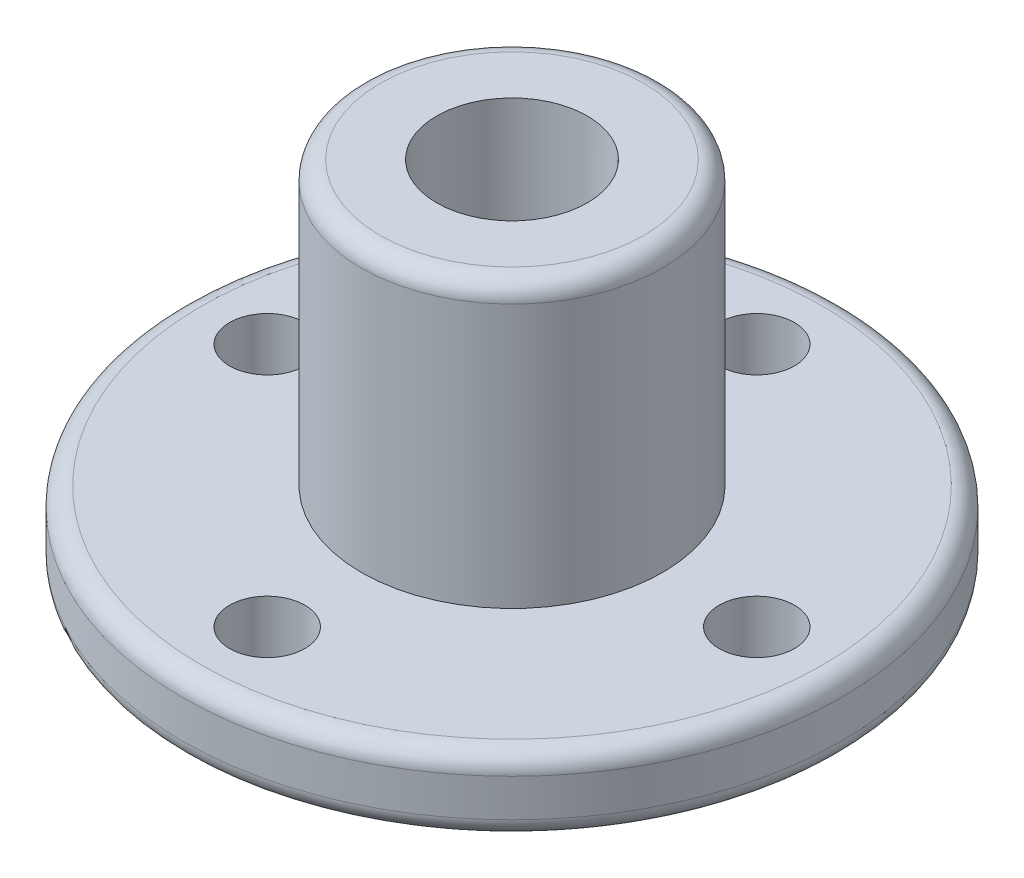
ISO-10303-21;
HEADER;
FILE_DESCRIPTION(('STEP AP214'),'2;1');
FILE_NAME('part.step','',(''),(''),'','','');
FILE_SCHEMA(('AUTOMOTIVE_DESIGN { 1 0 10303 214 1 1 1 1 }'));
ENDSEC;
DATA;
#1=APPLICATION_CONTEXT('core data for automotive mechanical design processes');
#2=APPLICATION_PROTOCOL_DEFINITION('international standard','automotive_design',2000,#1);
#3=PRODUCT_CONTEXT('',#1,'mechanical');
#4=PRODUCT('Part','Part','',(#3));
#5=PRODUCT_RELATED_PRODUCT_CATEGORY('part','',(#4));
#6=PRODUCT_DEFINITION_FORMATION('','',#4);
#7=PRODUCT_DEFINITION_CONTEXT('part definition',#1,'design');
#8=PRODUCT_DEFINITION('design','',#6,#7);
#9=PRODUCT_DEFINITION_SHAPE('','',#8);
#10=(LENGTH_UNIT() NAMED_UNIT(*) SI_UNIT(.MILLI.,.METRE.));
#11=(NAMED_UNIT(*) PLANE_ANGLE_UNIT() SI_UNIT($,.RADIAN.));
#12=(NAMED_UNIT(*) SI_UNIT($,.STERADIAN.) SOLID_ANGLE_UNIT());
#13=UNCERTAINTY_MEASURE_WITH_UNIT(LENGTH_MEASURE(1.E-05),#10,'distance_accuracy_value','');
#14=(GEOMETRIC_REPRESENTATION_CONTEXT(3) GLOBAL_UNCERTAINTY_ASSIGNED_CONTEXT((#13)) GLOBAL_UNIT_ASSIGNED_CONTEXT((#10,
#11,#12)) REPRESENTATION_CONTEXT('',''));
#15=CARTESIAN_POINT('',(0.,0.,0.));
#16=DIRECTION('',(0.,0.,1.));
#17=DIRECTION('',(1.,0.,0.));
#18=AXIS2_PLACEMENT_3D('',#15,#16,#17);
#19=CARTESIAN_POINT('',(0.,4.,0.));
#20=DIRECTION('',(0.,1.,0.));
#21=DIRECTION('',(0.,0.,1.));
#22=AXIS2_PLACEMENT_3D('',#19,#20,#21);
#23=PLANE('',#22);
#24=CARTESIAN_POINT('',(13.,4.,0.));
#25=DIRECTION('',(0.,1.,0.));
#26=DIRECTION('',(0.,0.,1.));
#27=AXIS2_PLACEMENT_3D('',#24,#25,#26);
#28=CIRCLE('',#27,2.);
#29=CARTESIAN_POINT('',(13.,4.,2.));
#30=VERTEX_POINT('',#29);
#31=EDGE_CURVE('E70',#30,#30,#28,.T.);
#32=ORIENTED_EDGE('',*,*,#31,.F.);
#33=EDGE_LOOP('',(#32));
#34=FACE_BOUND('',#33,.T.);
#35=CARTESIAN_POINT('',(0.,4.,-13.));
#36=DIRECTION('',(0.,1.,0.));
#37=DIRECTION('',(0.,0.,1.));
#38=AXIS2_PLACEMENT_3D('',#35,#36,#37);
#39=CIRCLE('',#38,2.);
#40=CARTESIAN_POINT('',(0.,4.,-11.));
#41=VERTEX_POINT('',#40);
#42=EDGE_CURVE('E60',#41,#41,#39,.T.);
#43=ORIENTED_EDGE('',*,*,#42,.F.);
#44=EDGE_LOOP('',(#43));
#45=FACE_BOUND('',#44,.T.);
#46=CARTESIAN_POINT('',(-13.,4.,0.));
#47=DIRECTION('',(0.,1.,0.));
#48=DIRECTION('',(0.,0.,1.));
#49=AXIS2_PLACEMENT_3D('',#46,#47,#48);
#50=CIRCLE('',#49,2.);
#51=CARTESIAN_POINT('',(-13.,4.,2.));
#52=VERTEX_POINT('',#51);
#53=EDGE_CURVE('E57',#52,#52,#50,.T.);
#54=ORIENTED_EDGE('',*,*,#53,.F.);
#55=EDGE_LOOP('',(#54));
#56=FACE_BOUND('',#55,.T.);
#57=CARTESIAN_POINT('',(0.,4.,13.));
#58=DIRECTION('',(0.,1.,0.));
#59=DIRECTION('',(0.,0.,1.));
#60=AXIS2_PLACEMENT_3D('',#57,#58,#59);
#61=CIRCLE('',#60,2.);
#62=CARTESIAN_POINT('',(0.,4.,15.));
#63=VERTEX_POINT('',#62);
#64=EDGE_CURVE('E54',#63,#63,#61,.T.);
#65=ORIENTED_EDGE('',*,*,#64,.F.);
#66=EDGE_LOOP('',(#65));
#67=FACE_BOUND('',#66,.T.);
#68=CARTESIAN_POINT('',(0.,4.,0.));
#69=DIRECTION('',(0.,1.,0.));
#70=DIRECTION('',(0.,0.,1.));
#71=AXIS2_PLACEMENT_3D('',#68,#69,#70);
#72=CIRCLE('',#71,16.5);
#73=CARTESIAN_POINT('',(0.,4.,16.5));
#74=VERTEX_POINT('',#73);
#75=EDGE_CURVE('E152',#74,#74,#72,.T.);
#76=ORIENTED_EDGE('',*,*,#75,.T.);
#77=EDGE_LOOP('',(#76));
#78=FACE_BOUND('',#77,.T.);
#79=CARTESIAN_POINT('',(0.,4.,0.));
#80=DIRECTION('',(0.,1.,0.));
#81=DIRECTION('',(0.,0.,1.));
#82=AXIS2_PLACEMENT_3D('',#79,#80,#81);
#83=CIRCLE('',#82,8.);
#84=CARTESIAN_POINT('',(0.,4.,8.));
#85=VERTEX_POINT('',#84);
#86=EDGE_CURVE('E141',#85,#85,#83,.T.);
#87=ORIENTED_EDGE('',*,*,#86,.F.);
#88=EDGE_LOOP('',(#87));
#89=FACE_BOUND('',#88,.T.);
#90=ADVANCED_FACE('F33',(#34,#45,#56,#67,#78,#89),#23,.T.);
#91=CARTESIAN_POINT('',(0.,4.,0.));
#92=DIRECTION('',(0.,-1.,0.));
#93=DIRECTION('',(0.,0.,-1.));
#94=AXIS2_PLACEMENT_3D('',#91,#92,#93);
#95=CYLINDRICAL_SURFACE('',#94,17.5);
#96=CARTESIAN_POINT('',(0.,3.,0.));
#97=DIRECTION('',(0.,1.,0.));
#98=DIRECTION('',(0.,0.,1.));
#99=AXIS2_PLACEMENT_3D('',#96,#97,#98);
#100=CIRCLE('',#99,17.5);
#101=CARTESIAN_POINT('',(0.,3.,17.5));
#102=VERTEX_POINT('',#101);
#103=EDGE_CURVE('E41',#102,#102,#100,.F.);
#104=ORIENTED_EDGE('',*,*,#103,.T.);
#105=EDGE_LOOP('',(#104));
#106=FACE_BOUND('',#105,.T.);
#107=CARTESIAN_POINT('',(0.,1.,0.));
#108=DIRECTION('',(0.,1.,0.));
#109=DIRECTION('',(0.,0.,1.));
#110=AXIS2_PLACEMENT_3D('',#107,#108,#109);
#111=CIRCLE('',#110,17.5);
#112=CARTESIAN_POINT('',(0.,1.,17.5));
#113=VERTEX_POINT('',#112);
#114=EDGE_CURVE('E46',#113,#113,#111,.T.);
#115=ORIENTED_EDGE('',*,*,#114,.T.);
#116=EDGE_LOOP('',(#115));
#117=FACE_BOUND('',#116,.T.);
#118=ADVANCED_FACE('F111',(#106,#117),#95,.T.);
#119=CARTESIAN_POINT('',(0.,0.,0.));
#120=DIRECTION('',(0.,1.,0.));
#121=DIRECTION('',(0.,0.,1.));
#122=AXIS2_PLACEMENT_3D('',#119,#120,#121);
#123=PLANE('',#122);
#124=CARTESIAN_POINT('',(13.,0.,0.));
#125=DIRECTION('',(0.,1.,0.));
#126=DIRECTION('',(0.,0.,1.));
#127=AXIS2_PLACEMENT_3D('',#124,#125,#126);
#128=CIRCLE('',#127,2.);
#129=CARTESIAN_POINT('',(13.,0.,2.));
#130=VERTEX_POINT('',#129);
#131=EDGE_CURVE('E37',#130,#130,#128,.T.);
#132=ORIENTED_EDGE('',*,*,#131,.T.);
#133=EDGE_LOOP('',(#132));
#134=FACE_BOUND('',#133,.T.);
#135=CARTESIAN_POINT('',(0.,0.,-13.));
#136=DIRECTION('',(0.,1.,0.));
#137=DIRECTION('',(0.,0.,1.));
#138=AXIS2_PLACEMENT_3D('',#135,#136,#137);
#139=CIRCLE('',#138,2.);
#140=CARTESIAN_POINT('',(0.,0.,-11.));
#141=VERTEX_POINT('',#140);
#142=EDGE_CURVE('E58',#141,#141,#139,.T.);
#143=ORIENTED_EDGE('',*,*,#142,.T.);
#144=EDGE_LOOP('',(#143));
#145=FACE_BOUND('',#144,.T.);
#146=CARTESIAN_POINT('',(-13.,0.,0.));
#147=DIRECTION('',(0.,1.,0.));
#148=DIRECTION('',(0.,0.,1.));
#149=AXIS2_PLACEMENT_3D('',#146,#147,#148);
#150=CIRCLE('',#149,2.);
#151=CARTESIAN_POINT('',(-13.,0.,2.));
#152=VERTEX_POINT('',#151);
#153=EDGE_CURVE('E55',#152,#152,#150,.T.);
#154=ORIENTED_EDGE('',*,*,#153,.T.);
#155=EDGE_LOOP('',(#154));
#156=FACE_BOUND('',#155,.T.);
#157=CARTESIAN_POINT('',(0.,0.,13.));
#158=DIRECTION('',(0.,1.,0.));
#159=DIRECTION('',(0.,0.,1.));
#160=AXIS2_PLACEMENT_3D('',#157,#158,#159);
#161=CIRCLE('',#160,2.);
#162=CARTESIAN_POINT('',(0.,0.,15.));
#163=VERTEX_POINT('',#162);
#164=EDGE_CURVE('E50',#163,#163,#161,.T.);
#165=ORIENTED_EDGE('',*,*,#164,.T.);
#166=EDGE_LOOP('',(#165));
#167=FACE_BOUND('',#166,.T.);
#168=CARTESIAN_POINT('',(0.,0.,0.));
#169=DIRECTION('',(0.,1.,0.));
#170=DIRECTION('',(0.,0.,1.));
#171=AXIS2_PLACEMENT_3D('',#168,#169,#170);
#172=CIRCLE('',#171,16.5);
#173=CARTESIAN_POINT('',(0.,0.,16.5));
#174=VERTEX_POINT('',#173);
#175=EDGE_CURVE('E10',#174,#174,#172,.F.);
#176=ORIENTED_EDGE('',*,*,#175,.T.);
#177=EDGE_LOOP('',(#176));
#178=FACE_BOUND('',#177,.T.);
#179=ADVANCED_FACE('F118',(#134,#145,#156,#167,#178),#123,.F.);
#180=CARTESIAN_POINT('',(0.,19.,0.));
#181=DIRECTION('',(0.,1.,0.));
#182=DIRECTION('',(0.,0.,1.));
#183=AXIS2_PLACEMENT_3D('',#180,#181,#182);
#184=PLANE('',#183);
#185=CARTESIAN_POINT('',(0.,19.,0.));
#186=DIRECTION('',(0.,1.,0.));
#187=DIRECTION('',(0.,0.,1.));
#188=AXIS2_PLACEMENT_3D('',#185,#186,#187);
#189=CIRCLE('',#188,7.);
#190=CARTESIAN_POINT('',(0.,19.,7.));
#191=VERTEX_POINT('',#190);
#192=EDGE_CURVE('E140',#191,#191,#189,.T.);
#193=ORIENTED_EDGE('',*,*,#192,.T.);
#194=EDGE_LOOP('',(#193));
#195=FACE_BOUND('',#194,.T.);
#196=CARTESIAN_POINT('',(0.,19.,0.));
#197=DIRECTION('',(0.,1.,0.));
#198=DIRECTION('',(0.,0.,1.));
#199=AXIS2_PLACEMENT_3D('',#196,#197,#198);
#200=CIRCLE('',#199,4.);
#201=CARTESIAN_POINT('',(0.,19.,4.));
#202=VERTEX_POINT('',#201);
#203=EDGE_CURVE('E147',#202,#202,#200,.T.);
#204=ORIENTED_EDGE('',*,*,#203,.F.);
#205=EDGE_LOOP('',(#204));
#206=FACE_BOUND('',#205,.T.);
#207=ADVANCED_FACE('F173',(#195,#206),#184,.T.);
#208=CARTESIAN_POINT('',(0.,19.,0.));
#209=DIRECTION('',(0.,-1.,0.));
#210=DIRECTION('',(0.,0.,-1.));
#211=AXIS2_PLACEMENT_3D('',#208,#209,#210);
#212=CYLINDRICAL_SURFACE('',#211,8.);
#213=CARTESIAN_POINT('',(0.,18.,0.));
#214=DIRECTION('',(0.,1.,0.));
#215=DIRECTION('',(0.,0.,1.));
#216=AXIS2_PLACEMENT_3D('',#213,#214,#215);
#217=CIRCLE('',#216,8.);
#218=CARTESIAN_POINT('',(0.,18.,8.));
#219=VERTEX_POINT('',#218);
#220=EDGE_CURVE('E144',#219,#219,#217,.F.);
#221=ORIENTED_EDGE('',*,*,#220,.T.);
#222=EDGE_LOOP('',(#221));
#223=FACE_BOUND('',#222,.T.);
#224=CARTESIAN_POINT('',(2.,12.,-7.74596669241483));
#225=CARTESIAN_POINT('',(1.99999686287446,11.8895593992587,-7.74596880070288));
#226=CARTESIAN_POINT('',(1.99082099639812,11.7790840810572,-7.74835444811678));
#227=CARTESIAN_POINT('',(1.95441850037103,11.5613059374612,-7.75761489594051));
#228=CARTESIAN_POINT('',(1.92718136539368,11.4540049964255,-7.76449230897304));
#229=CARTESIAN_POINT('',(1.85559295970563,11.2457571694503,-7.7819097967692));
#230=CARTESIAN_POINT('',(1.81126378228359,11.1448022756914,-7.79244514152366));
#231=CARTESIAN_POINT('',(1.70681691300911,10.9517513179681,-7.81598553623007));
#232=CARTESIAN_POINT('',(1.64669855084855,10.8596556303358,-7.82899069102791));
#233=CARTESIAN_POINT('',(1.5109667418495,10.6849106837902,-7.856325730845));
#234=CARTESIAN_POINT('',(1.43506951016324,10.60248511972,-7.87067678098427));
#235=CARTESIAN_POINT('',(1.27054565128053,10.4513908845117,-7.89890300412235));
#236=CARTESIAN_POINT('',(1.18191783534425,10.3827234995026,-7.91277813253111));
#237=CARTESIAN_POINT('',(0.992916160863164,10.260179625895,-7.93872332416466));
#238=CARTESIAN_POINT('',(0.892395660956096,10.2065228894708,-7.95076549920474));
#239=CARTESIAN_POINT('',(0.683410547434211,10.1169522846775,-7.97144649540787));
#240=CARTESIAN_POINT('',(0.574947108633553,10.0810357984676,-7.98008581867475));
#241=CARTESIAN_POINT('',(0.355487007003331,10.0286817323371,-7.99283807078544));
#242=CARTESIAN_POINT('',(0.244586175639182,10.0118642845387,-7.99703915075451));
#243=CARTESIAN_POINT('',(0.0214630554102163,9.99699329657956,-8.00074875285838));
#244=CARTESIAN_POINT('',(-0.090759035630454,9.99893698223232,-8.00025796877363));
#245=CARTESIAN_POINT('',(-0.310704494344773,10.0212598802001,-7.99470475962828));
#246=CARTESIAN_POINT('',(-0.418472431202132,10.0412290600431,-7.98974401872699));
#247=CARTESIAN_POINT('',(-0.629076494827371,10.0983770160388,-7.97592669219883));
#248=CARTESIAN_POINT('',(-0.731912358740875,10.1355567083019,-7.96706989918753));
#249=CARTESIAN_POINT('',(-0.930813407003612,10.2264020565496,-7.94630007760717));
#250=CARTESIAN_POINT('',(-1.02680901953301,10.2802136357294,-7.93436015756043));
#251=CARTESIAN_POINT('',(-1.20855124468098,10.402684543293,-7.90871923047719));
#252=CARTESIAN_POINT('',(-1.29429607017101,10.4713464548485,-7.89501791721992));
#253=CARTESIAN_POINT('',(-1.45554807016991,10.6237669935859,-7.86690971015616));
#254=CARTESIAN_POINT('',(-1.5307153581504,10.7078839138782,-7.85249375620734));
#255=CARTESIAN_POINT('',(-1.66595275192604,10.8876799788322,-7.82492034813365));
#256=CARTESIAN_POINT('',(-1.72602215209203,10.9833596635928,-7.81176295284776));
#257=CARTESIAN_POINT('',(-1.8295762580452,11.1842320273192,-7.78816397465319));
#258=CARTESIAN_POINT('',(-1.87297913394098,11.2894685842506,-7.77773586980577));
#259=CARTESIAN_POINT('',(-1.94137124127268,11.5060683744612,-7.76094912111966));
#260=CARTESIAN_POINT('',(-1.96636441310582,11.6174302911865,-7.75458960648175));
#261=CARTESIAN_POINT('',(-1.99666371093214,11.8399676012185,-7.74684284831313));
#262=CARTESIAN_POINT('',(-2.0024723791357,11.9510702346637,-7.74532871274919));
#263=CARTESIAN_POINT('',(-1.99561359241244,12.1726575492625,-7.74709874784831));
#264=CARTESIAN_POINT('',(-1.98294783827904,12.283142286361,-7.75038247681013));
#265=CARTESIAN_POINT('',(-1.93994037115013,12.4984914119638,-7.76125665563648));
#266=CARTESIAN_POINT('',(-1.9098912546254,12.6034181812567,-7.768775761875));
#267=CARTESIAN_POINT('',(-1.8332944653365,12.8067451662813,-7.7872057461677));
#268=CARTESIAN_POINT('',(-1.78674483817004,12.9051446072443,-7.79811702598891));
#269=CARTESIAN_POINT('',(-1.67741653434925,13.0947530222939,-7.8223690967461));
#270=CARTESIAN_POINT('',(-1.6143374030685,13.1857830720345,-7.83575334885313));
#271=CARTESIAN_POINT('',(-1.47412058586891,13.3561506902411,-7.86333666457373));
#272=CARTESIAN_POINT('',(-1.39698058961088,13.4354863333201,-7.87753586182776));
#273=CARTESIAN_POINT('',(-1.22852544196945,13.5822488340568,-7.90557922425285));
#274=CARTESIAN_POINT('',(-1.13690390506319,13.649328050039,-7.91940561649468));
#275=CARTESIAN_POINT('',(-0.943405365389351,13.767148693561,-7.94477773290987));
#276=CARTESIAN_POINT('',(-0.841528897915183,13.8178909732866,-7.95632357603169));
#277=CARTESIAN_POINT('',(-0.631116403462182,13.9011568276223,-7.9757609259065));
#278=CARTESIAN_POINT('',(-0.522634762055765,13.9338114275033,-7.98367864017925));
#279=CARTESIAN_POINT('',(-0.301499520637615,13.9803682676867,-7.99508234716634));
#280=CARTESIAN_POINT('',(-0.188846730082482,13.9942741269912,-7.99856919514738));
#281=CARTESIAN_POINT('',(0.0341670528866455,14.0027351791511,-8.00068338817612));
#282=CARTESIAN_POINT('',(0.144507653932043,13.9978034181908,-7.99943957759977));
#283=CARTESIAN_POINT('',(0.362734992829501,13.9699043454113,-7.99251792914887));
#284=CARTESIAN_POINT('',(0.470621803561856,13.9469375699737,-7.98684022314338));
#285=CARTESIAN_POINT('',(0.680342071289546,13.8838955604583,-7.97170865707778));
#286=CARTESIAN_POINT('',(0.782204989161724,13.8439130933712,-7.96227529004785));
#287=CARTESIAN_POINT('',(0.977834106083247,13.7480588419609,-7.94062577827316));
#288=CARTESIAN_POINT('',(1.07159928253127,13.692185054659,-7.92840928277515));
#289=CARTESIAN_POINT('',(1.25080385684661,13.5645695320077,-7.90214499360574));
#290=CARTESIAN_POINT('',(1.33598997659667,13.4924797141923,-7.88806033883329));
#291=CARTESIAN_POINT('',(1.49323004054701,13.3351542960453,-7.85981298114379));
#292=CARTESIAN_POINT('',(1.56528065015318,13.2499153677777,-7.84565025934604));
#293=CARTESIAN_POINT('',(1.69552405294366,13.0667971716211,-7.81854951691005));
#294=CARTESIAN_POINT('',(1.75343323883276,12.9687117532695,-7.80563927346578));
#295=CARTESIAN_POINT('',(1.85185379317094,12.7638890202504,-7.78287910989656));
#296=CARTESIAN_POINT('',(1.8923778195043,12.6571580678123,-7.77302696466427));
#297=CARTESIAN_POINT('',(1.948845057142,12.4588459763297,-7.75903817501475));
#298=CARTESIAN_POINT('',(1.96798634119376,12.3682136712277,-7.75417326006998));
#299=CARTESIAN_POINT('',(1.99356458514354,12.1850622620046,-7.7476367716524));
#300=CARTESIAN_POINT('',(2.0000026287435,12.0925433195112,-7.74596492578215));
#301=CARTESIAN_POINT('',(2.,12.,-7.74596669241483));
#302=B_SPLINE_CURVE_WITH_KNOTS('',3,(#224,#225,#226,#227,#228,#229,#230,#231,#232,#233,#234,
#235,#236,#237,#238,#239,#240,#241,#242,#243,#244,#245,#246,#247,#248,#249,#250,#251,#252,#253,
#254,#255,#256,#257,#258,#259,#260,#261,#262,#263,#264,#265,#266,#267,#268,#269,#270,#271,#272,
#273,#274,#275,#276,#277,#278,#279,#280,#281,#282,#283,#284,#285,#286,#287,#288,#289,#290,#291,
#292,#293,#294,#295,#296,#297,#298,#299,#300,#301),.UNSPECIFIED.,.T.,.F.,(4,2,2,2,2,2,2,2,2,2,2,
2,2,2,2,2,2,2,2,2,2,2,2,2,2,2,2,2,2,2,2,2,2,2,2,2,2,2,4),(0.,0.330981953388908,
0.662156593142932,0.992904581732819,1.32366661404383,1.66099163354381,1.99834817183893,
2.34041197118336,2.68242527877674,3.01751000796277,3.35254518932816,3.68014610151157,
4.00776445379829,4.33834299403555,4.6689790837513,5.00856373257529,5.34816424959842,
5.68941145606722,6.03058560103638,6.36274859809373,6.69488101747041,7.02157924007365,
7.34831617137134,7.68146276687326,8.01466415108036,8.35620264772255,8.69772332575642,
9.03673658245543,9.3756843912723,9.70546756901965,10.0352409390158,10.3632390124777,
10.6912784459046,11.0271767726566,11.3631602525241,11.7054118182895,12.0474137709606,
12.3247826174462,12.6021278008238),.UNSPECIFIED.);
#303=CARTESIAN_POINT('',(2.,12.,-7.74596669241483));
#304=VERTEX_POINT('',#303);
#305=EDGE_CURVE('E81',#304,#304,#302,.T.);
#306=ORIENTED_EDGE('',*,*,#305,.F.);
#307=EDGE_LOOP('',(#306));
#308=FACE_BOUND('',#307,.T.);
#309=ORIENTED_EDGE('',*,*,#86,.T.);
#310=EDGE_LOOP('',(#309));
#311=FACE_BOUND('',#310,.T.);
#312=ADVANCED_FACE('F134',(#223,#308,#311),#212,.T.);
#313=CARTESIAN_POINT('',(0.,19.,0.));
#314=DIRECTION('',(0.,-1.,0.));
#315=DIRECTION('',(0.,0.,-1.));
#316=AXIS2_PLACEMENT_3D('',#313,#314,#315);
#317=CYLINDRICAL_SURFACE('',#316,4.);
#318=CARTESIAN_POINT('',(2.,12.,-3.46410161513775));
#319=CARTESIAN_POINT('',(1.99999158748781,11.8957867945257,-3.46411185715888));
#320=CARTESIAN_POINT('',(1.99179963610437,11.7914378234662,-3.46887633544978));
#321=CARTESIAN_POINT('',(1.95944672580053,11.5859448227694,-3.48724701669072));
#322=CARTESIAN_POINT('',(1.93525221095662,11.4848079967522,-3.50087179788183));
#323=CARTESIAN_POINT('',(1.8721998159803,11.2890968435531,-3.53498701490001));
#324=CARTESIAN_POINT('',(1.83341988295963,11.1944907411508,-3.55544089069169));
#325=CARTESIAN_POINT('',(1.74253507245138,11.0131515495238,-3.60085327291133));
#326=CARTESIAN_POINT('',(1.69042947410139,10.9264188865632,-3.62581202301253));
#327=CARTESIAN_POINT('',(1.569333074538,10.7553885568666,-3.67993738819289));
#328=CARTESIAN_POINT('',(1.49930407053533,10.6718817324082,-3.70928127465103));
#329=CARTESIAN_POINT('',(1.34650761698202,10.5171832194294,-3.76743965382121));
#330=CARTESIAN_POINT('',(1.26373385204841,10.445997673796,-3.79625387610258));
#331=CARTESIAN_POINT('',(1.08097912631265,10.3132656988115,-3.85242953961661));
#332=CARTESIAN_POINT('',(0.980214377887154,10.2526924645767,-3.87956212851245));
#333=CARTESIAN_POINT('',(0.768314053336918,10.1497182932129,-3.92701512184167));
#334=CARTESIAN_POINT('',(0.657185076311986,10.1073058876492,-3.94733982363631));
#335=CARTESIAN_POINT('',(0.436089887818818,10.0449906774688,-3.97760922492053));
#336=CARTESIAN_POINT('',(0.326603580968786,10.0237009473079,-3.98818960442739));
#337=CARTESIAN_POINT('',(0.105141257404541,9.99966776263097,-4.00015167691179));
#338=CARTESIAN_POINT('',(-0.00683321168520656,9.99691308640372,-4.00153893568935));
#339=CARTESIAN_POINT('',(-0.219665048849571,10.0094933479451,-3.99525963833124));
#340=CARTESIAN_POINT('',(-0.320642398354138,10.0232760310436,-3.98836991784381));
#341=CARTESIAN_POINT('',(-0.518627543836088,10.0657616878081,-3.96748490519435));
#342=CARTESIAN_POINT('',(-0.6156350421877,10.0944657779521,-3.95348908132771));
#343=CARTESIAN_POINT('',(-0.804618783139258,10.1661651321799,-3.91943166575325));
#344=CARTESIAN_POINT('',(-0.896506847030396,10.2093526263442,-3.89928883058403));
#345=CARTESIAN_POINT('',(-1.07195360302661,10.3085268324029,-3.8547529197337));
#346=CARTESIAN_POINT('',(-1.15550929767728,10.3645181266047,-3.83035832314967));
#347=CARTESIAN_POINT('',(-1.3203473217964,10.4937907030661,-3.7768878879846));
#348=CARTESIAN_POINT('',(-1.40066815005872,10.568206056652,-3.7475875199635));
#349=CARTESIAN_POINT('',(-1.54820874059556,10.7291794498603,-3.68908681173623));
#350=CARTESIAN_POINT('',(-1.61541842314846,10.8157467445481,-3.65988656531258));
#351=CARTESIAN_POINT('',(-1.73901066928442,11.0052963848482,-3.60288312184969));
#352=CARTESIAN_POINT('',(-1.7944346299561,11.1089720461084,-3.57528639981415));
#353=CARTESIAN_POINT('',(-1.88663822600246,11.325875342718,-3.52750900557152));
#354=CARTESIAN_POINT('',(-1.92343731642178,11.4390928660351,-3.50732060092135));
#355=CARTESIAN_POINT('',(-1.97436042205008,11.6624290225656,-3.47889271634069));
#356=CARTESIAN_POINT('',(-1.99005024423995,11.7720822380871,-3.46983311696993));
#357=CARTESIAN_POINT('',(-2.00303389322285,11.9928026830331,-3.46235838723219));
#358=CARTESIAN_POINT('',(-2.00034071463005,12.1038688582396,-3.46393573778623));
#359=CARTESIAN_POINT('',(-1.97807208668793,12.3113078371574,-3.4766867308117));
#360=CARTESIAN_POINT('',(-1.96037563342492,12.4079589022158,-3.48679175013308));
#361=CARTESIAN_POINT('',(-1.91139256926489,12.596735572542,-3.51388043102682));
#362=CARTESIAN_POINT('',(-1.88010155724727,12.6888597014935,-3.53086632010068));
#363=CARTESIAN_POINT('',(-1.80329517720973,12.8708226618051,-3.57072444159313));
#364=CARTESIAN_POINT('',(-1.7571881273853,12.9603580337061,-3.59383286486126));
#365=CARTESIAN_POINT('',(-1.65257412803176,13.130938543079,-3.643122389945));
#366=CARTESIAN_POINT('',(-1.59406080866498,13.2119792870305,-3.66930506710298));
#367=CARTESIAN_POINT('',(-1.45767433439709,13.3739575350427,-3.72575996912669));
#368=CARTESIAN_POINT('',(-1.37829054462748,13.4535943014178,-3.75613166308566));
#369=CARTESIAN_POINT('',(-1.20680899079904,13.5988244760047,-3.81468469955797));
#370=CARTESIAN_POINT('',(-1.11470694931991,13.6644131405268,-3.84286530015463));
#371=CARTESIAN_POINT('',(-0.91707072510806,13.7811474518327,-3.89482723381868));
#372=CARTESIAN_POINT('',(-0.811246195112495,13.8318662361668,-3.91847283343884));
#373=CARTESIAN_POINT('',(-0.591044729317865,13.9142758079696,-3.95766709918776));
#374=CARTESIAN_POINT('',(-0.476675402917653,13.9459833036841,-3.97322287353397));
#375=CARTESIAN_POINT('',(-0.253959364539764,13.9867371274851,-3.99335016363174));
#376=CARTESIAN_POINT('',(-0.1460228872683,13.9975957486643,-3.9987985581427));
#377=CARTESIAN_POINT('',(0.0702519714699455,14.0016865339957,-4.00084260752374));
#378=CARTESIAN_POINT('',(0.178590198981614,13.9949248685289,-3.99744136141634));
#379=CARTESIAN_POINT('',(0.385075986136858,13.9651671756836,-3.98267937668509));
#380=CARTESIAN_POINT('',(0.483424641057418,13.9432702626909,-3.97185789309443));
#381=CARTESIAN_POINT('',(0.674891898931563,13.8853460401933,-3.94384187353387));
#382=CARTESIAN_POINT('',(0.768009749669771,13.8493167042931,-3.92664642364424));
#383=CARTESIAN_POINT('',(0.95084683359674,13.7625457450086,-3.8865186139318));
#384=CARTESIAN_POINT('',(1.0402503657229,13.7112407802481,-3.86337234005404));
#385=CARTESIAN_POINT('',(1.20954920326828,13.5960847118819,-3.81376266676027));
#386=CARTESIAN_POINT('',(1.28944011444319,13.5322278458984,-3.78729774583428));
#387=CARTESIAN_POINT('',(1.44582833859495,13.3864033644406,-3.73057218840582));
#388=CARTESIAN_POINT('',(1.52119665879199,13.3032658191997,-3.70019591726075));
#389=CARTESIAN_POINT('',(1.65732528394006,13.1251077716939,-3.64126158628571));
#390=CARTESIAN_POINT('',(1.71807266521244,13.0300768686395,-3.61270515130784));
#391=CARTESIAN_POINT('',(1.82486714716811,12.8266911058698,-3.55999186256751));
#392=CARTESIAN_POINT('',(1.87038902381914,12.7180100892647,-3.53600256268535));
#393=CARTESIAN_POINT('',(1.92395929504801,12.5494218803691,-3.5069621813237));
#394=CARTESIAN_POINT('',(1.93935666147967,12.4923521794093,-3.49844389329401));
#395=CARTESIAN_POINT('',(1.96508069805043,12.3767674424998,-3.48406059323535));
#396=CARTESIAN_POINT('',(1.97541091343282,12.3182534472457,-3.47819372636051));
#397=CARTESIAN_POINT('',(1.9887293296122,12.2163992107527,-3.47059023668758));
#398=CARTESIAN_POINT('',(1.99295091983786,12.1732669427499,-3.46816389731816));
#399=CARTESIAN_POINT('',(1.99858810035606,12.0867643069071,-3.46491740045177));
#400=CARTESIAN_POINT('',(2.00000350293331,12.0433939233333,-3.46409735040492));
#401=CARTESIAN_POINT('',(2.,12.,-3.46410161513775));
#402=B_SPLINE_CURVE_WITH_KNOTS('',3,(#318,#319,#320,#321,#322,#323,#324,#325,#326,#327,#328,
#329,#330,#331,#332,#333,#334,#335,#336,#337,#338,#339,#340,#341,#342,#343,#344,#345,#346,#347,
#348,#349,#350,#351,#352,#353,#354,#355,#356,#357,#358,#359,#360,#361,#362,#363,#364,#365,#366,
#367,#368,#369,#370,#371,#372,#373,#374,#375,#376,#377,#378,#379,#380,#381,#382,#383,#384,#385,
#386,#387,#388,#389,#390,#391,#392,#393,#394,#395,#396,#397,#398,#399,#400,#401),.UNSPECIFIED.,
.T.,.F.,(4,2,2,2,2,2,2,2,2,2,2,2,2,2,2,2,2,2,2,2,2,2,2,2,2,2,2,2,2,2,2,2,2,2,2,2,2,2,2,2,2,4),
(0.,0.312464245189432,0.62558578564961,0.937057191861534,1.24854545093096,1.58572462503713,
1.92307142172808,2.28315784481593,2.64301653931849,2.97726969939937,3.31132047376146,
3.61632194973143,3.92134625038977,4.2305906946636,4.5399459870461,4.87854382917848,
5.21740096495904,5.57777683462963,5.93777548427476,6.2692458171249,6.60048186380813,
6.89548366852117,7.19058104876193,7.49934592816242,7.80826972444161,8.15613487165293,
8.50411729960471,8.86128362829998,9.2181355962161,9.5422454078304,9.8662417359201,
10.1688884974705,10.4715786702809,10.7872150144301,11.102996602055,11.450204837042,
11.7977188569437,12.1562149808128,12.3351395323571,12.5139387197526,12.6440387634036,
12.7741475095882),.UNSPECIFIED.);
#403=CARTESIAN_POINT('',(2.,12.,-3.46410161513775));
#404=VERTEX_POINT('',#403);
#405=EDGE_CURVE('E53',#404,#404,#402,.T.);
#406=ORIENTED_EDGE('',*,*,#405,.T.);
#407=EDGE_LOOP('',(#406));
#408=FACE_BOUND('',#407,.T.);
#409=ORIENTED_EDGE('',*,*,#203,.T.);
#410=EDGE_LOOP('',(#409));
#411=FACE_BOUND('',#410,.T.);
#412=CARTESIAN_POINT('',(0.,4.,0.));
#413=DIRECTION('',(0.,1.,0.));
#414=DIRECTION('',(0.,0.,1.));
#415=AXIS2_PLACEMENT_3D('',#412,#413,#414);
#416=CIRCLE('',#415,4.);
#417=CARTESIAN_POINT('',(0.,4.,4.));
#418=VERTEX_POINT('',#417);
#419=EDGE_CURVE('E138',#418,#418,#416,.F.);
#420=ORIENTED_EDGE('',*,*,#419,.T.);
#421=EDGE_LOOP('',(#420));
#422=FACE_BOUND('',#421,.T.);
#423=ADVANCED_FACE('F126',(#408,#411,#422),#317,.F.);
#424=ORIENTED_EDGE('',*,*,#419,.F.);
#425=EDGE_LOOP('',(#424));
#426=FACE_BOUND('',#425,.T.);
#427=ADVANCED_FACE('F114',(#426),#23,.T.);
#428=CARTESIAN_POINT('',(0.,12.,-17.501));
#429=DIRECTION('',(0.,0.,1.));
#430=DIRECTION('',(1.,0.,0.));
#431=AXIS2_PLACEMENT_3D('',#428,#429,#430);
#432=CYLINDRICAL_SURFACE('',#431,2.);
#433=ORIENTED_EDGE('',*,*,#405,.F.);
#434=EDGE_LOOP('',(#433));
#435=FACE_BOUND('',#434,.T.);
#436=ORIENTED_EDGE('',*,*,#305,.T.);
#437=EDGE_LOOP('',(#436));
#438=FACE_BOUND('',#437,.T.);
#439=ADVANCED_FACE('F86',(#435,#438),#432,.F.);
#440=CARTESIAN_POINT('',(0.,18.,0.));
#441=DIRECTION('',(0.,1.,0.));
#442=DIRECTION('',(0.,0.,1.));
#443=AXIS2_PLACEMENT_3D('',#440,#441,#442);
#444=TOROIDAL_SURFACE('',#443,7.,1.);
#445=ORIENTED_EDGE('',*,*,#220,.F.);
#446=EDGE_LOOP('',(#445));
#447=FACE_BOUND('',#446,.T.);
#448=ORIENTED_EDGE('',*,*,#192,.F.);
#449=EDGE_LOOP('',(#448));
#450=FACE_BOUND('',#449,.T.);
#451=ADVANCED_FACE('F132',(#447,#450),#444,.T.);
#452=CARTESIAN_POINT('',(0.,3.,0.));
#453=DIRECTION('',(0.,1.,0.));
#454=DIRECTION('',(0.,0.,1.));
#455=AXIS2_PLACEMENT_3D('',#452,#453,#454);
#456=TOROIDAL_SURFACE('',#455,16.5,1.);
#457=ORIENTED_EDGE('',*,*,#103,.F.);
#458=EDGE_LOOP('',(#457));
#459=FACE_BOUND('',#458,.T.);
#460=ORIENTED_EDGE('',*,*,#75,.F.);
#461=EDGE_LOOP('',(#460));
#462=FACE_BOUND('',#461,.T.);
#463=ADVANCED_FACE('F159',(#459,#462),#456,.T.);
#464=CARTESIAN_POINT('',(0.,1.,0.));
#465=DIRECTION('',(0.,1.,0.));
#466=DIRECTION('',(0.,0.,1.));
#467=AXIS2_PLACEMENT_3D('',#464,#465,#466);
#468=TOROIDAL_SURFACE('',#467,16.5,1.);
#469=ORIENTED_EDGE('',*,*,#175,.F.);
#470=EDGE_LOOP('',(#469));
#471=FACE_BOUND('',#470,.T.);
#472=ORIENTED_EDGE('',*,*,#114,.F.);
#473=EDGE_LOOP('',(#472));
#474=FACE_BOUND('',#473,.T.);
#475=ADVANCED_FACE('F35',(#471,#474),#468,.T.);
#476=CARTESIAN_POINT('',(0.,-11.,13.));
#477=DIRECTION('',(0.,1.,0.));
#478=DIRECTION('',(0.,0.,1.));
#479=AXIS2_PLACEMENT_3D('',#476,#477,#478);
#480=CYLINDRICAL_SURFACE('',#479,2.);
#481=ORIENTED_EDGE('',*,*,#64,.T.);
#482=EDGE_LOOP('',(#481));
#483=FACE_BOUND('',#482,.T.);
#484=ORIENTED_EDGE('',*,*,#164,.F.);
#485=EDGE_LOOP('',(#484));
#486=FACE_BOUND('',#485,.T.);
#487=ADVANCED_FACE('F91',(#483,#486),#480,.F.);
#488=CARTESIAN_POINT('',(-13.,-11.,0.));
#489=DIRECTION('',(0.,1.,0.));
#490=DIRECTION('',(0.,0.,1.));
#491=AXIS2_PLACEMENT_3D('',#488,#489,#490);
#492=CYLINDRICAL_SURFACE('',#491,2.);
#493=ORIENTED_EDGE('',*,*,#53,.T.);
#494=EDGE_LOOP('',(#493));
#495=FACE_BOUND('',#494,.T.);
#496=ORIENTED_EDGE('',*,*,#153,.F.);
#497=EDGE_LOOP('',(#496));
#498=FACE_BOUND('',#497,.T.);
#499=ADVANCED_FACE('F95',(#495,#498),#492,.F.);
#500=CARTESIAN_POINT('',(0.,-11.,-13.));
#501=DIRECTION('',(0.,1.,0.));
#502=DIRECTION('',(0.,0.,1.));
#503=AXIS2_PLACEMENT_3D('',#500,#501,#502);
#504=CYLINDRICAL_SURFACE('',#503,2.);
#505=ORIENTED_EDGE('',*,*,#42,.T.);
#506=EDGE_LOOP('',(#505));
#507=FACE_BOUND('',#506,.T.);
#508=ORIENTED_EDGE('',*,*,#142,.F.);
#509=EDGE_LOOP('',(#508));
#510=FACE_BOUND('',#509,.T.);
#511=ADVANCED_FACE('F99',(#507,#510),#504,.F.);
#512=CARTESIAN_POINT('',(13.,-11.,0.));
#513=DIRECTION('',(0.,1.,0.));
#514=DIRECTION('',(0.,0.,1.));
#515=AXIS2_PLACEMENT_3D('',#512,#513,#514);
#516=CYLINDRICAL_SURFACE('',#515,2.);
#517=ORIENTED_EDGE('',*,*,#31,.T.);
#518=EDGE_LOOP('',(#517));
#519=FACE_BOUND('',#518,.T.);
#520=ORIENTED_EDGE('',*,*,#131,.F.);
#521=EDGE_LOOP('',(#520));
#522=FACE_BOUND('',#521,.T.);
#523=ADVANCED_FACE('F103',(#519,#522),#516,.F.);
#524=CLOSED_SHELL('',(#90,#118,#179,#207,#312,#423,#427,#439,#451,#463,#475,#487,#499,#511,#523));
#525=MANIFOLD_SOLID_BREP('B2',#524);
#526=ADVANCED_BREP_SHAPE_REPRESENTATION('',(#18,#525),#14);
#527=SHAPE_DEFINITION_REPRESENTATION(#9,#526);
ENDSEC;
END-ISO-10303-21;
